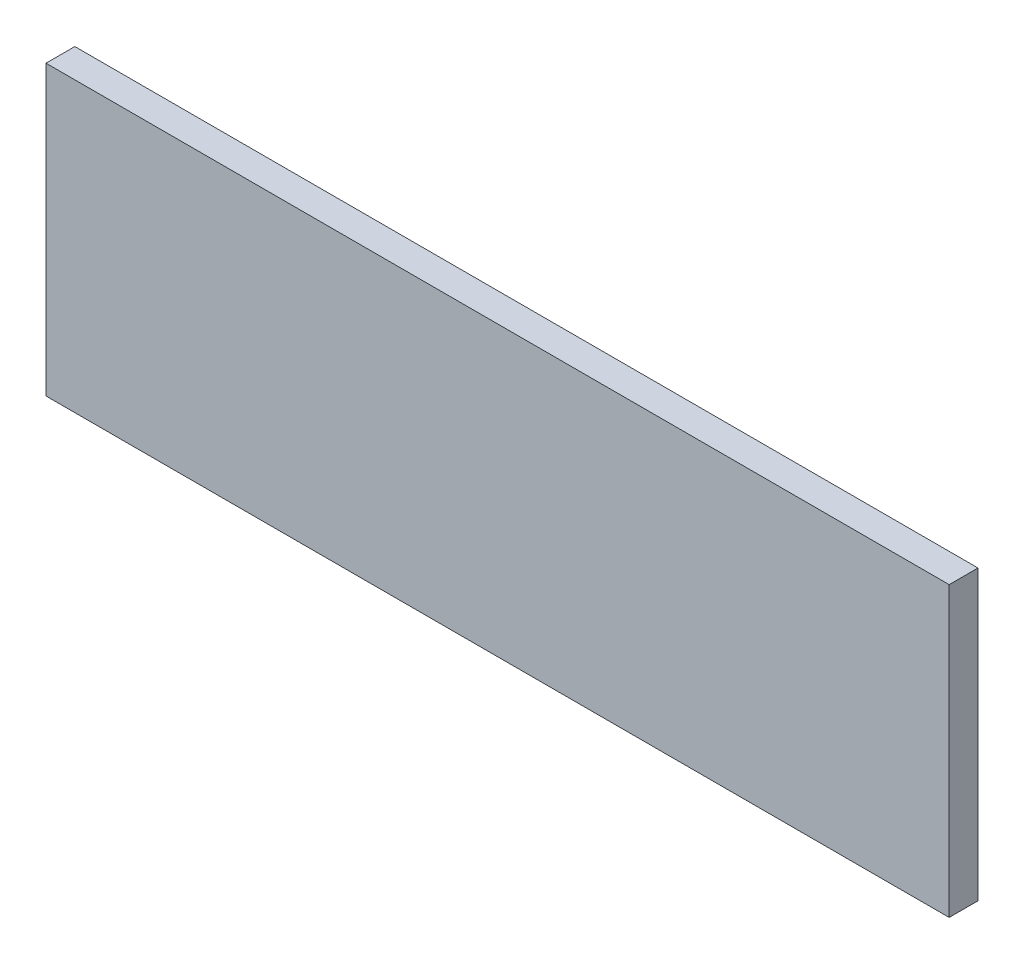
ISO-10303-21;
HEADER;
FILE_DESCRIPTION(('STEP AP214'),'2;1');
FILE_NAME('part.step','',(''),(''),'','','');
FILE_SCHEMA(('AUTOMOTIVE_DESIGN { 1 0 10303 214 1 1 1 1 }'));
ENDSEC;
DATA;
#1=APPLICATION_CONTEXT('core data for automotive mechanical design processes');
#2=APPLICATION_PROTOCOL_DEFINITION('international standard','automotive_design',2000,#1);
#3=PRODUCT_CONTEXT('',#1,'mechanical');
#4=PRODUCT('Part','Part','',(#3));
#5=PRODUCT_RELATED_PRODUCT_CATEGORY('part','',(#4));
#6=PRODUCT_DEFINITION_FORMATION('','',#4);
#7=PRODUCT_DEFINITION_CONTEXT('part definition',#1,'design');
#8=PRODUCT_DEFINITION('design','',#6,#7);
#9=PRODUCT_DEFINITION_SHAPE('','',#8);
#10=(LENGTH_UNIT() NAMED_UNIT(*) SI_UNIT(.MILLI.,.METRE.));
#11=(NAMED_UNIT(*) PLANE_ANGLE_UNIT() SI_UNIT($,.RADIAN.));
#12=(NAMED_UNIT(*) SI_UNIT($,.STERADIAN.) SOLID_ANGLE_UNIT());
#13=UNCERTAINTY_MEASURE_WITH_UNIT(LENGTH_MEASURE(1.E-05),#10,'distance_accuracy_value','');
#14=(GEOMETRIC_REPRESENTATION_CONTEXT(3) GLOBAL_UNCERTAINTY_ASSIGNED_CONTEXT((#13)) GLOBAL_UNIT_ASSIGNED_CONTEXT((#10,
#11,#12)) REPRESENTATION_CONTEXT('',''));
#15=CARTESIAN_POINT('',(0.,0.,0.));
#16=DIRECTION('',(0.,0.,1.));
#17=DIRECTION('',(1.,0.,0.));
#18=AXIS2_PLACEMENT_3D('',#15,#16,#17);
#19=CARTESIAN_POINT('',(-94.,-30.,6.));
#20=DIRECTION('',(1.,0.,0.));
#21=DIRECTION('',(0.,0.,-1.));
#22=AXIS2_PLACEMENT_3D('',#19,#20,#21);
#23=PLANE('',#22);
#24=DIRECTION('',(0.,-1.,0.));
#25=VECTOR('',#24,1.);
#26=CARTESIAN_POINT('',(-94.,-30.,0.));
#27=LINE('',#26,#25);
#28=CARTESIAN_POINT('',(-94.,30.,0.));
#29=VERTEX_POINT('',#28);
#30=CARTESIAN_POINT('',(-94.,-30.,0.));
#31=VERTEX_POINT('',#30);
#32=EDGE_CURVE('E96',#29,#31,#27,.T.);
#33=ORIENTED_EDGE('',*,*,#32,.T.);
#34=DIRECTION('',(0.,0.,-1.));
#35=VECTOR('',#34,1.);
#36=CARTESIAN_POINT('',(-94.,-30.,6.));
#37=LINE('',#36,#35);
#38=CARTESIAN_POINT('',(-94.,-30.,6.));
#39=VERTEX_POINT('',#38);
#40=EDGE_CURVE('E11',#39,#31,#37,.T.);
#41=ORIENTED_EDGE('',*,*,#40,.F.);
#42=DIRECTION('',(0.,-1.,0.));
#43=VECTOR('',#42,1.);
#44=CARTESIAN_POINT('',(-94.,-30.,6.));
#45=LINE('',#44,#43);
#46=CARTESIAN_POINT('',(-94.,30.,6.));
#47=VERTEX_POINT('',#46);
#48=EDGE_CURVE('E84',#47,#39,#45,.T.);
#49=ORIENTED_EDGE('',*,*,#48,.F.);
#50=DIRECTION('',(0.,0.,-1.));
#51=VECTOR('',#50,1.);
#52=CARTESIAN_POINT('',(-94.,30.,6.));
#53=LINE('',#52,#51);
#54=EDGE_CURVE('E92',#47,#29,#53,.T.);
#55=ORIENTED_EDGE('',*,*,#54,.T.);
#56=EDGE_LOOP('',(#33,#41,#49,#55));
#57=FACE_BOUND('',#56,.T.);
#58=ADVANCED_FACE('F33',(#57),#23,.F.);
#59=CARTESIAN_POINT('',(94.,-30.,6.));
#60=DIRECTION('',(0.,1.,0.));
#61=DIRECTION('',(-1.,0.,0.));
#62=AXIS2_PLACEMENT_3D('',#59,#60,#61);
#63=PLANE('',#62);
#64=DIRECTION('',(1.,0.,0.));
#65=VECTOR('',#64,1.);
#66=CARTESIAN_POINT('',(94.,-30.,0.));
#67=LINE('',#66,#65);
#68=CARTESIAN_POINT('',(94.,-30.,0.));
#69=VERTEX_POINT('',#68);
#70=EDGE_CURVE('E88',#31,#69,#67,.T.);
#71=ORIENTED_EDGE('',*,*,#70,.T.);
#72=DIRECTION('',(0.,0.,-1.));
#73=VECTOR('',#72,1.);
#74=CARTESIAN_POINT('',(94.,-30.,6.));
#75=LINE('',#74,#73);
#76=CARTESIAN_POINT('',(94.,-30.,6.));
#77=VERTEX_POINT('',#76);
#78=EDGE_CURVE('E41',#77,#69,#75,.T.);
#79=ORIENTED_EDGE('',*,*,#78,.F.);
#80=DIRECTION('',(1.,0.,0.));
#81=VECTOR('',#80,1.);
#82=CARTESIAN_POINT('',(94.,-30.,6.));
#83=LINE('',#82,#81);
#84=EDGE_CURVE('E79',#39,#77,#83,.T.);
#85=ORIENTED_EDGE('',*,*,#84,.F.);
#86=ORIENTED_EDGE('',*,*,#40,.T.);
#87=EDGE_LOOP('',(#71,#79,#85,#86));
#88=FACE_BOUND('',#87,.T.);
#89=ADVANCED_FACE('F87',(#88),#63,.F.);
#90=CARTESIAN_POINT('',(94.,-30.,6.));
#91=DIRECTION('',(-1.,0.,0.));
#92=DIRECTION('',(0.,0.,1.));
#93=AXIS2_PLACEMENT_3D('',#90,#91,#92);
#94=PLANE('',#93);
#95=DIRECTION('',(0.,1.,0.));
#96=VECTOR('',#95,1.);
#97=CARTESIAN_POINT('',(94.,-30.,0.));
#98=LINE('',#97,#96);
#99=CARTESIAN_POINT('',(94.,30.,0.));
#100=VERTEX_POINT('',#99);
#101=EDGE_CURVE('E66',#69,#100,#98,.T.);
#102=ORIENTED_EDGE('',*,*,#101,.T.);
#103=DIRECTION('',(0.,0.,-1.));
#104=VECTOR('',#103,1.);
#105=CARTESIAN_POINT('',(94.,30.,6.));
#106=LINE('',#105,#104);
#107=CARTESIAN_POINT('',(94.,30.,6.));
#108=VERTEX_POINT('',#107);
#109=EDGE_CURVE('E89',#108,#100,#106,.T.);
#110=ORIENTED_EDGE('',*,*,#109,.F.);
#111=DIRECTION('',(0.,1.,0.));
#112=VECTOR('',#111,1.);
#113=CARTESIAN_POINT('',(94.,-30.,6.));
#114=LINE('',#113,#112);
#115=EDGE_CURVE('E82',#77,#108,#114,.T.);
#116=ORIENTED_EDGE('',*,*,#115,.F.);
#117=ORIENTED_EDGE('',*,*,#78,.T.);
#118=EDGE_LOOP('',(#102,#110,#116,#117));
#119=FACE_BOUND('',#118,.T.);
#120=ADVANCED_FACE('F90',(#119),#94,.F.);
#121=CARTESIAN_POINT('',(94.,30.,6.));
#122=DIRECTION('',(0.,-1.,0.));
#123=DIRECTION('',(1.,0.,0.));
#124=AXIS2_PLACEMENT_3D('',#121,#122,#123);
#125=PLANE('',#124);
#126=DIRECTION('',(-1.,0.,0.));
#127=VECTOR('',#126,1.);
#128=CARTESIAN_POINT('',(94.,30.,0.));
#129=LINE('',#128,#127);
#130=EDGE_CURVE('E72',#100,#29,#129,.T.);
#131=ORIENTED_EDGE('',*,*,#130,.T.);
#132=ORIENTED_EDGE('',*,*,#54,.F.);
#133=DIRECTION('',(-1.,0.,0.));
#134=VECTOR('',#133,1.);
#135=CARTESIAN_POINT('',(94.,30.,6.));
#136=LINE('',#135,#134);
#137=EDGE_CURVE('E49',#108,#47,#136,.T.);
#138=ORIENTED_EDGE('',*,*,#137,.F.);
#139=ORIENTED_EDGE('',*,*,#109,.T.);
#140=EDGE_LOOP('',(#131,#132,#138,#139));
#141=FACE_BOUND('',#140,.T.);
#142=ADVANCED_FACE('F103',(#141),#125,.F.);
#143=CARTESIAN_POINT('',(0.,0.,6.));
#144=DIRECTION('',(0.,0.,1.));
#145=DIRECTION('',(1.,0.,0.));
#146=AXIS2_PLACEMENT_3D('',#143,#144,#145);
#147=PLANE('',#146);
#148=ORIENTED_EDGE('',*,*,#48,.T.);
#149=ORIENTED_EDGE('',*,*,#84,.T.);
#150=ORIENTED_EDGE('',*,*,#115,.T.);
#151=ORIENTED_EDGE('',*,*,#137,.T.);
#152=EDGE_LOOP('',(#148,#149,#150,#151));
#153=FACE_BOUND('',#152,.T.);
#154=ADVANCED_FACE('F80',(#153),#147,.T.);
#155=CARTESIAN_POINT('',(0.,0.,0.));
#156=DIRECTION('',(0.,0.,1.));
#157=DIRECTION('',(1.,0.,0.));
#158=AXIS2_PLACEMENT_3D('',#155,#156,#157);
#159=PLANE('',#158);
#160=ORIENTED_EDGE('',*,*,#32,.F.);
#161=ORIENTED_EDGE('',*,*,#130,.F.);
#162=ORIENTED_EDGE('',*,*,#101,.F.);
#163=ORIENTED_EDGE('',*,*,#70,.F.);
#164=EDGE_LOOP('',(#160,#161,#162,#163));
#165=FACE_BOUND('',#164,.T.);
#166=ADVANCED_FACE('F106',(#165),#159,.F.);
#167=CLOSED_SHELL('',(#58,#89,#120,#142,#154,#166));
#168=MANIFOLD_SOLID_BREP('B2',#167);
#169=ADVANCED_BREP_SHAPE_REPRESENTATION('',(#18,#168),#14);
#170=SHAPE_DEFINITION_REPRESENTATION(#9,#169);
ENDSEC;
END-ISO-10303-21;
